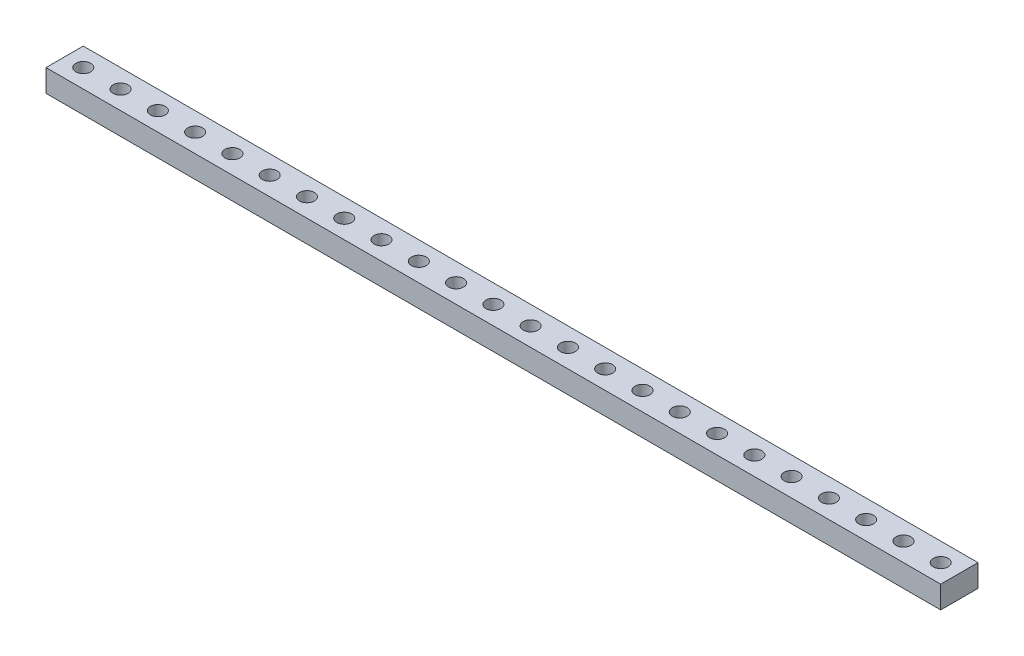
ISO-10303-21;
HEADER;
FILE_DESCRIPTION(('STEP AP214'),'2;1');
FILE_NAME('part.step','',(''),(''),'','','');
FILE_SCHEMA(('AUTOMOTIVE_DESIGN { 1 0 10303 214 1 1 1 1 }'));
ENDSEC;
DATA;
#1=APPLICATION_CONTEXT('core data for automotive mechanical design processes');
#2=APPLICATION_PROTOCOL_DEFINITION('international standard','automotive_design',2000,#1);
#3=PRODUCT_CONTEXT('',#1,'mechanical');
#4=PRODUCT('Part','Part','',(#3));
#5=PRODUCT_RELATED_PRODUCT_CATEGORY('part','',(#4));
#6=PRODUCT_DEFINITION_FORMATION('','',#4);
#7=PRODUCT_DEFINITION_CONTEXT('part definition',#1,'design');
#8=PRODUCT_DEFINITION('design','',#6,#7);
#9=PRODUCT_DEFINITION_SHAPE('','',#8);
#10=(LENGTH_UNIT() NAMED_UNIT(*) SI_UNIT(.MILLI.,.METRE.));
#11=(NAMED_UNIT(*) PLANE_ANGLE_UNIT() SI_UNIT($,.RADIAN.));
#12=(NAMED_UNIT(*) SI_UNIT($,.STERADIAN.) SOLID_ANGLE_UNIT());
#13=UNCERTAINTY_MEASURE_WITH_UNIT(LENGTH_MEASURE(1.E-05),#10,'distance_accuracy_value','');
#14=(GEOMETRIC_REPRESENTATION_CONTEXT(3) GLOBAL_UNCERTAINTY_ASSIGNED_CONTEXT((#13)) GLOBAL_UNIT_ASSIGNED_CONTEXT((#10,
#11,#12)) REPRESENTATION_CONTEXT('',''));
#15=CARTESIAN_POINT('',(0.,0.,0.));
#16=DIRECTION('',(0.,0.,1.));
#17=DIRECTION('',(1.,0.,0.));
#18=AXIS2_PLACEMENT_3D('',#15,#16,#17);
#19=CARTESIAN_POINT('',(0.,6.,0.));
#20=DIRECTION('',(0.,-1.,0.));
#21=DIRECTION('',(0.,0.,-1.));
#22=AXIS2_PLACEMENT_3D('',#19,#20,#21);
#23=PLANE('',#22);
#24=DIRECTION('',(1.,0.,0.));
#25=VECTOR('',#24,1.);
#26=CARTESIAN_POINT('',(0.,6.,0.));
#27=LINE('',#26,#25);
#28=CARTESIAN_POINT('',(-140.,6.,0.));
#29=VERTEX_POINT('',#28);
#30=CARTESIAN_POINT('',(100.,6.,0.));
#31=VERTEX_POINT('',#30);
#32=EDGE_CURVE('E89',#29,#31,#27,.T.);
#33=ORIENTED_EDGE('',*,*,#32,.T.);
#34=DIRECTION('',(0.,0.,1.));
#35=VECTOR('',#34,1.);
#36=CARTESIAN_POINT('',(100.,6.,-10.));
#37=LINE('',#36,#35);
#38=CARTESIAN_POINT('',(100.,6.,-10.));
#39=VERTEX_POINT('',#38);
#40=EDGE_CURVE('E244',#39,#31,#37,.T.);
#41=ORIENTED_EDGE('',*,*,#40,.F.);
#42=DIRECTION('',(-1.,0.,0.));
#43=VECTOR('',#42,1.);
#44=CARTESIAN_POINT('',(-140.,6.,-9.99999999999998));
#45=LINE('',#44,#43);
#46=CARTESIAN_POINT('',(-140.,6.,-9.99999999999998));
#47=VERTEX_POINT('',#46);
#48=EDGE_CURVE('E91',#39,#47,#45,.T.);
#49=ORIENTED_EDGE('',*,*,#48,.T.);
#50=DIRECTION('',(0.,0.,1.));
#51=VECTOR('',#50,1.);
#52=CARTESIAN_POINT('',(-140.,6.,0.));
#53=LINE('',#52,#51);
#54=EDGE_CURVE('E60',#47,#29,#53,.T.);
#55=ORIENTED_EDGE('',*,*,#54,.T.);
#56=EDGE_LOOP('',(#33,#41,#49,#55));
#57=FACE_BOUND('',#56,.T.);
#58=CARTESIAN_POINT('',(-135.,6.,-4.99999999999998));
#59=DIRECTION('',(0.,1.,0.));
#60=DIRECTION('',(0.,0.,1.));
#61=AXIS2_PLACEMENT_3D('',#58,#59,#60);
#62=CIRCLE('',#61,2.);
#63=CARTESIAN_POINT('',(-135.,6.,-2.99999999999999));
#64=VERTEX_POINT('',#63);
#65=EDGE_CURVE('E83',#64,#64,#62,.T.);
#66=ORIENTED_EDGE('',*,*,#65,.F.);
#67=EDGE_LOOP('',(#66));
#68=FACE_BOUND('',#67,.T.);
#69=CARTESIAN_POINT('',(-125.,6.,-4.99999999999998));
#70=DIRECTION('',(0.,1.,0.));
#71=DIRECTION('',(0.,0.,1.));
#72=AXIS2_PLACEMENT_3D('',#69,#70,#71);
#73=CIRCLE('',#72,1.99999999999998);
#74=CARTESIAN_POINT('',(-125.,6.,-3.));
#75=VERTEX_POINT('',#74);
#76=EDGE_CURVE('E100',#75,#75,#73,.T.);
#77=ORIENTED_EDGE('',*,*,#76,.F.);
#78=EDGE_LOOP('',(#77));
#79=FACE_BOUND('',#78,.T.);
#80=CARTESIAN_POINT('',(-115.,6.,-4.99999999999998));
#81=DIRECTION('',(0.,1.,0.));
#82=DIRECTION('',(0.,0.,1.));
#83=AXIS2_PLACEMENT_3D('',#80,#81,#82);
#84=CIRCLE('',#83,2.);
#85=CARTESIAN_POINT('',(-115.,6.,-2.99999999999999));
#86=VERTEX_POINT('',#85);
#87=EDGE_CURVE('E106',#86,#86,#84,.T.);
#88=ORIENTED_EDGE('',*,*,#87,.F.);
#89=EDGE_LOOP('',(#88));
#90=FACE_BOUND('',#89,.T.);
#91=CARTESIAN_POINT('',(-105.,6.,-4.99999999999998));
#92=DIRECTION('',(0.,1.,0.));
#93=DIRECTION('',(0.,0.,1.));
#94=AXIS2_PLACEMENT_3D('',#91,#92,#93);
#95=CIRCLE('',#94,2.);
#96=CARTESIAN_POINT('',(-105.,6.,-2.99999999999999));
#97=VERTEX_POINT('',#96);
#98=EDGE_CURVE('E112',#97,#97,#95,.T.);
#99=ORIENTED_EDGE('',*,*,#98,.F.);
#100=EDGE_LOOP('',(#99));
#101=FACE_BOUND('',#100,.T.);
#102=CARTESIAN_POINT('',(-95.,6.,-4.99999999999998));
#103=DIRECTION('',(0.,1.,0.));
#104=DIRECTION('',(0.,0.,1.));
#105=AXIS2_PLACEMENT_3D('',#102,#103,#104);
#106=CIRCLE('',#105,2.);
#107=CARTESIAN_POINT('',(-95.,6.,-2.99999999999999));
#108=VERTEX_POINT('',#107);
#109=EDGE_CURVE('E118',#108,#108,#106,.T.);
#110=ORIENTED_EDGE('',*,*,#109,.F.);
#111=EDGE_LOOP('',(#110));
#112=FACE_BOUND('',#111,.T.);
#113=CARTESIAN_POINT('',(-85.,6.,-4.99999999999998));
#114=DIRECTION('',(0.,1.,0.));
#115=DIRECTION('',(0.,0.,1.));
#116=AXIS2_PLACEMENT_3D('',#113,#114,#115);
#117=CIRCLE('',#116,2.);
#118=CARTESIAN_POINT('',(-85.,6.,-2.99999999999999));
#119=VERTEX_POINT('',#118);
#120=EDGE_CURVE('E124',#119,#119,#117,.T.);
#121=ORIENTED_EDGE('',*,*,#120,.F.);
#122=EDGE_LOOP('',(#121));
#123=FACE_BOUND('',#122,.T.);
#124=CARTESIAN_POINT('',(-75.,6.,-4.99999999999998));
#125=DIRECTION('',(0.,1.,0.));
#126=DIRECTION('',(0.,0.,1.));
#127=AXIS2_PLACEMENT_3D('',#124,#125,#126);
#128=CIRCLE('',#127,2.);
#129=CARTESIAN_POINT('',(-75.,6.,-2.99999999999999));
#130=VERTEX_POINT('',#129);
#131=EDGE_CURVE('E130',#130,#130,#128,.T.);
#132=ORIENTED_EDGE('',*,*,#131,.F.);
#133=EDGE_LOOP('',(#132));
#134=FACE_BOUND('',#133,.T.);
#135=CARTESIAN_POINT('',(-65.,6.,-4.99999999999998));
#136=DIRECTION('',(0.,1.,0.));
#137=DIRECTION('',(0.,0.,1.));
#138=AXIS2_PLACEMENT_3D('',#135,#136,#137);
#139=CIRCLE('',#138,2.);
#140=CARTESIAN_POINT('',(-65.,6.,-2.99999999999999));
#141=VERTEX_POINT('',#140);
#142=EDGE_CURVE('E136',#141,#141,#139,.T.);
#143=ORIENTED_EDGE('',*,*,#142,.F.);
#144=EDGE_LOOP('',(#143));
#145=FACE_BOUND('',#144,.T.);
#146=CARTESIAN_POINT('',(-55.,6.,-4.99999999999998));
#147=DIRECTION('',(0.,1.,0.));
#148=DIRECTION('',(0.,0.,1.));
#149=AXIS2_PLACEMENT_3D('',#146,#147,#148);
#150=CIRCLE('',#149,2.);
#151=CARTESIAN_POINT('',(-55.,6.,-2.99999999999999));
#152=VERTEX_POINT('',#151);
#153=EDGE_CURVE('E142',#152,#152,#150,.T.);
#154=ORIENTED_EDGE('',*,*,#153,.F.);
#155=EDGE_LOOP('',(#154));
#156=FACE_BOUND('',#155,.T.);
#157=CARTESIAN_POINT('',(-45.,6.,-4.99999999999998));
#158=DIRECTION('',(0.,1.,0.));
#159=DIRECTION('',(0.,0.,1.));
#160=AXIS2_PLACEMENT_3D('',#157,#158,#159);
#161=CIRCLE('',#160,2.);
#162=CARTESIAN_POINT('',(-45.,6.,-2.99999999999999));
#163=VERTEX_POINT('',#162);
#164=EDGE_CURVE('E148',#163,#163,#161,.T.);
#165=ORIENTED_EDGE('',*,*,#164,.F.);
#166=EDGE_LOOP('',(#165));
#167=FACE_BOUND('',#166,.T.);
#168=CARTESIAN_POINT('',(-35.,6.,-4.99999999999998));
#169=DIRECTION('',(0.,1.,0.));
#170=DIRECTION('',(0.,0.,1.));
#171=AXIS2_PLACEMENT_3D('',#168,#169,#170);
#172=CIRCLE('',#171,2.);
#173=CARTESIAN_POINT('',(-35.,6.,-2.99999999999999));
#174=VERTEX_POINT('',#173);
#175=EDGE_CURVE('E154',#174,#174,#172,.T.);
#176=ORIENTED_EDGE('',*,*,#175,.F.);
#177=EDGE_LOOP('',(#176));
#178=FACE_BOUND('',#177,.T.);
#179=CARTESIAN_POINT('',(-25.,6.,-4.99999999999998));
#180=DIRECTION('',(0.,1.,0.));
#181=DIRECTION('',(0.,0.,1.));
#182=AXIS2_PLACEMENT_3D('',#179,#180,#181);
#183=CIRCLE('',#182,2.);
#184=CARTESIAN_POINT('',(-25.,6.,-2.99999999999999));
#185=VERTEX_POINT('',#184);
#186=EDGE_CURVE('E160',#185,#185,#183,.T.);
#187=ORIENTED_EDGE('',*,*,#186,.F.);
#188=EDGE_LOOP('',(#187));
#189=FACE_BOUND('',#188,.T.);
#190=CARTESIAN_POINT('',(-15.,6.,-4.99999999999998));
#191=DIRECTION('',(0.,1.,0.));
#192=DIRECTION('',(0.,0.,1.));
#193=AXIS2_PLACEMENT_3D('',#190,#191,#192);
#194=CIRCLE('',#193,2.);
#195=CARTESIAN_POINT('',(-15.,6.,-2.99999999999999));
#196=VERTEX_POINT('',#195);
#197=EDGE_CURVE('E166',#196,#196,#194,.T.);
#198=ORIENTED_EDGE('',*,*,#197,.F.);
#199=EDGE_LOOP('',(#198));
#200=FACE_BOUND('',#199,.T.);
#201=CARTESIAN_POINT('',(-5.,6.,-4.99999999999998));
#202=DIRECTION('',(0.,1.,0.));
#203=DIRECTION('',(0.,0.,1.));
#204=AXIS2_PLACEMENT_3D('',#201,#202,#203);
#205=CIRCLE('',#204,2.);
#206=CARTESIAN_POINT('',(-5.,6.,-2.99999999999999));
#207=VERTEX_POINT('',#206);
#208=EDGE_CURVE('E172',#207,#207,#205,.T.);
#209=ORIENTED_EDGE('',*,*,#208,.F.);
#210=EDGE_LOOP('',(#209));
#211=FACE_BOUND('',#210,.T.);
#212=CARTESIAN_POINT('',(5.,6.,-4.99999999999998));
#213=DIRECTION('',(0.,1.,0.));
#214=DIRECTION('',(0.,0.,1.));
#215=AXIS2_PLACEMENT_3D('',#212,#213,#214);
#216=CIRCLE('',#215,2.);
#217=CARTESIAN_POINT('',(5.,6.,-2.99999999999999));
#218=VERTEX_POINT('',#217);
#219=EDGE_CURVE('E178',#218,#218,#216,.T.);
#220=ORIENTED_EDGE('',*,*,#219,.F.);
#221=EDGE_LOOP('',(#220));
#222=FACE_BOUND('',#221,.T.);
#223=CARTESIAN_POINT('',(15.,6.,-4.99999999999998));
#224=DIRECTION('',(0.,1.,0.));
#225=DIRECTION('',(0.,0.,1.));
#226=AXIS2_PLACEMENT_3D('',#223,#224,#225);
#227=CIRCLE('',#226,2.);
#228=CARTESIAN_POINT('',(15.,6.,-2.99999999999999));
#229=VERTEX_POINT('',#228);
#230=EDGE_CURVE('E184',#229,#229,#227,.T.);
#231=ORIENTED_EDGE('',*,*,#230,.F.);
#232=EDGE_LOOP('',(#231));
#233=FACE_BOUND('',#232,.T.);
#234=CARTESIAN_POINT('',(25.,6.,-4.99999999999998));
#235=DIRECTION('',(0.,1.,0.));
#236=DIRECTION('',(0.,0.,1.));
#237=AXIS2_PLACEMENT_3D('',#234,#235,#236);
#238=CIRCLE('',#237,2.);
#239=CARTESIAN_POINT('',(25.,6.,-2.99999999999999));
#240=VERTEX_POINT('',#239);
#241=EDGE_CURVE('E190',#240,#240,#238,.T.);
#242=ORIENTED_EDGE('',*,*,#241,.F.);
#243=EDGE_LOOP('',(#242));
#244=FACE_BOUND('',#243,.T.);
#245=CARTESIAN_POINT('',(35.,6.,-4.99999999999998));
#246=DIRECTION('',(0.,1.,0.));
#247=DIRECTION('',(0.,0.,1.));
#248=AXIS2_PLACEMENT_3D('',#245,#246,#247);
#249=CIRCLE('',#248,2.);
#250=CARTESIAN_POINT('',(35.,6.,-2.99999999999999));
#251=VERTEX_POINT('',#250);
#252=EDGE_CURVE('E196',#251,#251,#249,.T.);
#253=ORIENTED_EDGE('',*,*,#252,.F.);
#254=EDGE_LOOP('',(#253));
#255=FACE_BOUND('',#254,.T.);
#256=CARTESIAN_POINT('',(45.,6.,-4.99999999999998));
#257=DIRECTION('',(0.,1.,0.));
#258=DIRECTION('',(0.,0.,1.));
#259=AXIS2_PLACEMENT_3D('',#256,#257,#258);
#260=CIRCLE('',#259,2.);
#261=CARTESIAN_POINT('',(45.,6.,-2.99999999999999));
#262=VERTEX_POINT('',#261);
#263=EDGE_CURVE('E202',#262,#262,#260,.T.);
#264=ORIENTED_EDGE('',*,*,#263,.F.);
#265=EDGE_LOOP('',(#264));
#266=FACE_BOUND('',#265,.T.);
#267=CARTESIAN_POINT('',(55.,6.,-4.99999999999998));
#268=DIRECTION('',(0.,1.,0.));
#269=DIRECTION('',(0.,0.,1.));
#270=AXIS2_PLACEMENT_3D('',#267,#268,#269);
#271=CIRCLE('',#270,2.);
#272=CARTESIAN_POINT('',(55.,6.,-2.99999999999999));
#273=VERTEX_POINT('',#272);
#274=EDGE_CURVE('E208',#273,#273,#271,.T.);
#275=ORIENTED_EDGE('',*,*,#274,.F.);
#276=EDGE_LOOP('',(#275));
#277=FACE_BOUND('',#276,.T.);
#278=CARTESIAN_POINT('',(65.,6.,-4.99999999999998));
#279=DIRECTION('',(0.,1.,0.));
#280=DIRECTION('',(0.,0.,1.));
#281=AXIS2_PLACEMENT_3D('',#278,#279,#280);
#282=CIRCLE('',#281,2.);
#283=CARTESIAN_POINT('',(65.,6.,-2.99999999999999));
#284=VERTEX_POINT('',#283);
#285=EDGE_CURVE('E214',#284,#284,#282,.T.);
#286=ORIENTED_EDGE('',*,*,#285,.F.);
#287=EDGE_LOOP('',(#286));
#288=FACE_BOUND('',#287,.T.);
#289=CARTESIAN_POINT('',(75.,6.,-4.99999999999998));
#290=DIRECTION('',(0.,1.,0.));
#291=DIRECTION('',(0.,0.,1.));
#292=AXIS2_PLACEMENT_3D('',#289,#290,#291);
#293=CIRCLE('',#292,2.);
#294=CARTESIAN_POINT('',(75.,6.,-2.99999999999999));
#295=VERTEX_POINT('',#294);
#296=EDGE_CURVE('E220',#295,#295,#293,.T.);
#297=ORIENTED_EDGE('',*,*,#296,.F.);
#298=EDGE_LOOP('',(#297));
#299=FACE_BOUND('',#298,.T.);
#300=CARTESIAN_POINT('',(85.,6.,-4.99999999999998));
#301=DIRECTION('',(0.,1.,0.));
#302=DIRECTION('',(0.,0.,1.));
#303=AXIS2_PLACEMENT_3D('',#300,#301,#302);
#304=CIRCLE('',#303,2.);
#305=CARTESIAN_POINT('',(85.,6.,-2.99999999999999));
#306=VERTEX_POINT('',#305);
#307=EDGE_CURVE('E226',#306,#306,#304,.T.);
#308=ORIENTED_EDGE('',*,*,#307,.F.);
#309=EDGE_LOOP('',(#308));
#310=FACE_BOUND('',#309,.T.);
#311=CARTESIAN_POINT('',(95.,6.,-4.99999999999998));
#312=DIRECTION('',(0.,1.,0.));
#313=DIRECTION('',(0.,0.,1.));
#314=AXIS2_PLACEMENT_3D('',#311,#312,#313);
#315=CIRCLE('',#314,2.);
#316=CARTESIAN_POINT('',(95.,6.,-2.99999999999999));
#317=VERTEX_POINT('',#316);
#318=EDGE_CURVE('E232',#317,#317,#315,.T.);
#319=ORIENTED_EDGE('',*,*,#318,.F.);
#320=EDGE_LOOP('',(#319));
#321=FACE_BOUND('',#320,.T.);
#322=ADVANCED_FACE('F36',(#57,#68,#79,#90,#101,#112,#123,#134,#145,#156,#167,#178,#189,#200,
#211,#222,#233,#244,#255,#266,#277,#288,#299,#310,#321),#23,.F.);
#323=CARTESIAN_POINT('',(0.,0.,0.));
#324=DIRECTION('',(0.,-1.,0.));
#325=DIRECTION('',(0.,0.,-1.));
#326=AXIS2_PLACEMENT_3D('',#323,#324,#325);
#327=PLANE('',#326);
#328=DIRECTION('',(0.,0.,1.));
#329=VECTOR('',#328,1.);
#330=CARTESIAN_POINT('',(100.,0.,-10.));
#331=LINE('',#330,#329);
#332=CARTESIAN_POINT('',(100.,0.,-9.99999999999998));
#333=VERTEX_POINT('',#332);
#334=CARTESIAN_POINT('',(100.,0.,0.));
#335=VERTEX_POINT('',#334);
#336=EDGE_CURVE('E51',#333,#335,#331,.T.);
#337=ORIENTED_EDGE('',*,*,#336,.T.);
#338=DIRECTION('',(1.,0.,0.));
#339=VECTOR('',#338,1.);
#340=CARTESIAN_POINT('',(0.,0.,0.));
#341=LINE('',#340,#339);
#342=CARTESIAN_POINT('',(-140.,0.,0.));
#343=VERTEX_POINT('',#342);
#344=EDGE_CURVE('E73',#343,#335,#341,.T.);
#345=ORIENTED_EDGE('',*,*,#344,.F.);
#346=DIRECTION('',(0.,0.,1.));
#347=VECTOR('',#346,1.);
#348=CARTESIAN_POINT('',(-140.,0.,0.));
#349=LINE('',#348,#347);
#350=CARTESIAN_POINT('',(-140.,0.,-9.99999999999998));
#351=VERTEX_POINT('',#350);
#352=EDGE_CURVE('E78',#351,#343,#349,.T.);
#353=ORIENTED_EDGE('',*,*,#352,.F.);
#354=DIRECTION('',(-1.,0.,0.));
#355=VECTOR('',#354,1.);
#356=CARTESIAN_POINT('',(-140.,0.,-9.99999999999998));
#357=LINE('',#356,#355);
#358=EDGE_CURVE('E82',#333,#351,#357,.T.);
#359=ORIENTED_EDGE('',*,*,#358,.F.);
#360=EDGE_LOOP('',(#337,#345,#353,#359));
#361=FACE_BOUND('',#360,.T.);
#362=CARTESIAN_POINT('',(85.,0.,-4.99999999999998));
#363=DIRECTION('',(0.,1.,0.));
#364=DIRECTION('',(0.,0.,1.));
#365=AXIS2_PLACEMENT_3D('',#362,#363,#364);
#366=CIRCLE('',#365,2.);
#367=CARTESIAN_POINT('',(85.,0.,-2.99999999999999));
#368=VERTEX_POINT('',#367);
#369=EDGE_CURVE('E229',#368,#368,#366,.T.);
#370=ORIENTED_EDGE('',*,*,#369,.T.);
#371=EDGE_LOOP('',(#370));
#372=FACE_BOUND('',#371,.T.);
#373=CARTESIAN_POINT('',(65.,0.,-4.99999999999998));
#374=DIRECTION('',(0.,1.,0.));
#375=DIRECTION('',(0.,0.,1.));
#376=AXIS2_PLACEMENT_3D('',#373,#374,#375);
#377=CIRCLE('',#376,2.);
#378=CARTESIAN_POINT('',(65.,0.,-2.99999999999999));
#379=VERTEX_POINT('',#378);
#380=EDGE_CURVE('E217',#379,#379,#377,.T.);
#381=ORIENTED_EDGE('',*,*,#380,.T.);
#382=EDGE_LOOP('',(#381));
#383=FACE_BOUND('',#382,.T.);
#384=CARTESIAN_POINT('',(45.,0.,-4.99999999999998));
#385=DIRECTION('',(0.,1.,0.));
#386=DIRECTION('',(0.,0.,1.));
#387=AXIS2_PLACEMENT_3D('',#384,#385,#386);
#388=CIRCLE('',#387,2.);
#389=CARTESIAN_POINT('',(45.,0.,-2.99999999999999));
#390=VERTEX_POINT('',#389);
#391=EDGE_CURVE('E205',#390,#390,#388,.T.);
#392=ORIENTED_EDGE('',*,*,#391,.T.);
#393=EDGE_LOOP('',(#392));
#394=FACE_BOUND('',#393,.T.);
#395=CARTESIAN_POINT('',(25.,0.,-4.99999999999998));
#396=DIRECTION('',(0.,1.,0.));
#397=DIRECTION('',(0.,0.,1.));
#398=AXIS2_PLACEMENT_3D('',#395,#396,#397);
#399=CIRCLE('',#398,2.);
#400=CARTESIAN_POINT('',(25.,0.,-2.99999999999999));
#401=VERTEX_POINT('',#400);
#402=EDGE_CURVE('E193',#401,#401,#399,.T.);
#403=ORIENTED_EDGE('',*,*,#402,.T.);
#404=EDGE_LOOP('',(#403));
#405=FACE_BOUND('',#404,.T.);
#406=CARTESIAN_POINT('',(5.,0.,-4.99999999999998));
#407=DIRECTION('',(0.,1.,0.));
#408=DIRECTION('',(0.,0.,1.));
#409=AXIS2_PLACEMENT_3D('',#406,#407,#408);
#410=CIRCLE('',#409,2.);
#411=CARTESIAN_POINT('',(5.,0.,-2.99999999999999));
#412=VERTEX_POINT('',#411);
#413=EDGE_CURVE('E181',#412,#412,#410,.T.);
#414=ORIENTED_EDGE('',*,*,#413,.T.);
#415=EDGE_LOOP('',(#414));
#416=FACE_BOUND('',#415,.T.);
#417=CARTESIAN_POINT('',(-15.,0.,-4.99999999999998));
#418=DIRECTION('',(0.,1.,0.));
#419=DIRECTION('',(0.,0.,1.));
#420=AXIS2_PLACEMENT_3D('',#417,#418,#419);
#421=CIRCLE('',#420,2.);
#422=CARTESIAN_POINT('',(-15.,0.,-2.99999999999999));
#423=VERTEX_POINT('',#422);
#424=EDGE_CURVE('E169',#423,#423,#421,.T.);
#425=ORIENTED_EDGE('',*,*,#424,.T.);
#426=EDGE_LOOP('',(#425));
#427=FACE_BOUND('',#426,.T.);
#428=CARTESIAN_POINT('',(-35.,0.,-4.99999999999998));
#429=DIRECTION('',(0.,1.,0.));
#430=DIRECTION('',(0.,0.,1.));
#431=AXIS2_PLACEMENT_3D('',#428,#429,#430);
#432=CIRCLE('',#431,2.);
#433=CARTESIAN_POINT('',(-35.,0.,-2.99999999999999));
#434=VERTEX_POINT('',#433);
#435=EDGE_CURVE('E157',#434,#434,#432,.T.);
#436=ORIENTED_EDGE('',*,*,#435,.T.);
#437=EDGE_LOOP('',(#436));
#438=FACE_BOUND('',#437,.T.);
#439=CARTESIAN_POINT('',(-55.,0.,-4.99999999999998));
#440=DIRECTION('',(0.,1.,0.));
#441=DIRECTION('',(0.,0.,1.));
#442=AXIS2_PLACEMENT_3D('',#439,#440,#441);
#443=CIRCLE('',#442,2.);
#444=CARTESIAN_POINT('',(-55.,0.,-2.99999999999999));
#445=VERTEX_POINT('',#444);
#446=EDGE_CURVE('E145',#445,#445,#443,.T.);
#447=ORIENTED_EDGE('',*,*,#446,.T.);
#448=EDGE_LOOP('',(#447));
#449=FACE_BOUND('',#448,.T.);
#450=CARTESIAN_POINT('',(-75.,0.,-4.99999999999998));
#451=DIRECTION('',(0.,1.,0.));
#452=DIRECTION('',(0.,0.,1.));
#453=AXIS2_PLACEMENT_3D('',#450,#451,#452);
#454=CIRCLE('',#453,2.);
#455=CARTESIAN_POINT('',(-75.,0.,-2.99999999999999));
#456=VERTEX_POINT('',#455);
#457=EDGE_CURVE('E133',#456,#456,#454,.T.);
#458=ORIENTED_EDGE('',*,*,#457,.T.);
#459=EDGE_LOOP('',(#458));
#460=FACE_BOUND('',#459,.T.);
#461=CARTESIAN_POINT('',(-95.,0.,-4.99999999999998));
#462=DIRECTION('',(0.,1.,0.));
#463=DIRECTION('',(0.,0.,1.));
#464=AXIS2_PLACEMENT_3D('',#461,#462,#463);
#465=CIRCLE('',#464,2.);
#466=CARTESIAN_POINT('',(-95.,0.,-2.99999999999999));
#467=VERTEX_POINT('',#466);
#468=EDGE_CURVE('E121',#467,#467,#465,.T.);
#469=ORIENTED_EDGE('',*,*,#468,.T.);
#470=EDGE_LOOP('',(#469));
#471=FACE_BOUND('',#470,.T.);
#472=CARTESIAN_POINT('',(-115.,0.,-4.99999999999998));
#473=DIRECTION('',(0.,1.,0.));
#474=DIRECTION('',(0.,0.,1.));
#475=AXIS2_PLACEMENT_3D('',#472,#473,#474);
#476=CIRCLE('',#475,2.);
#477=CARTESIAN_POINT('',(-115.,0.,-2.99999999999999));
#478=VERTEX_POINT('',#477);
#479=EDGE_CURVE('E109',#478,#478,#476,.T.);
#480=ORIENTED_EDGE('',*,*,#479,.T.);
#481=EDGE_LOOP('',(#480));
#482=FACE_BOUND('',#481,.T.);
#483=CARTESIAN_POINT('',(-135.,0.,-4.99999999999998));
#484=DIRECTION('',(0.,1.,0.));
#485=DIRECTION('',(0.,0.,1.));
#486=AXIS2_PLACEMENT_3D('',#483,#484,#485);
#487=CIRCLE('',#486,2.);
#488=CARTESIAN_POINT('',(-135.,0.,-2.99999999999999));
#489=VERTEX_POINT('',#488);
#490=EDGE_CURVE('E97',#489,#489,#487,.T.);
#491=ORIENTED_EDGE('',*,*,#490,.T.);
#492=EDGE_LOOP('',(#491));
#493=FACE_BOUND('',#492,.T.);
#494=CARTESIAN_POINT('',(-125.,0.,-4.99999999999998));
#495=DIRECTION('',(0.,1.,0.));
#496=DIRECTION('',(0.,0.,1.));
#497=AXIS2_PLACEMENT_3D('',#494,#495,#496);
#498=CIRCLE('',#497,1.99999999999998);
#499=CARTESIAN_POINT('',(-125.,0.,-3.));
#500=VERTEX_POINT('',#499);
#501=EDGE_CURVE('E103',#500,#500,#498,.T.);
#502=ORIENTED_EDGE('',*,*,#501,.T.);
#503=EDGE_LOOP('',(#502));
#504=FACE_BOUND('',#503,.T.);
#505=CARTESIAN_POINT('',(-105.,0.,-4.99999999999998));
#506=DIRECTION('',(0.,1.,0.));
#507=DIRECTION('',(0.,0.,1.));
#508=AXIS2_PLACEMENT_3D('',#505,#506,#507);
#509=CIRCLE('',#508,2.);
#510=CARTESIAN_POINT('',(-105.,0.,-2.99999999999999));
#511=VERTEX_POINT('',#510);
#512=EDGE_CURVE('E115',#511,#511,#509,.T.);
#513=ORIENTED_EDGE('',*,*,#512,.T.);
#514=EDGE_LOOP('',(#513));
#515=FACE_BOUND('',#514,.T.);
#516=CARTESIAN_POINT('',(-85.,0.,-4.99999999999998));
#517=DIRECTION('',(0.,1.,0.));
#518=DIRECTION('',(0.,0.,1.));
#519=AXIS2_PLACEMENT_3D('',#516,#517,#518);
#520=CIRCLE('',#519,2.);
#521=CARTESIAN_POINT('',(-85.,0.,-2.99999999999999));
#522=VERTEX_POINT('',#521);
#523=EDGE_CURVE('E127',#522,#522,#520,.T.);
#524=ORIENTED_EDGE('',*,*,#523,.T.);
#525=EDGE_LOOP('',(#524));
#526=FACE_BOUND('',#525,.T.);
#527=CARTESIAN_POINT('',(-65.,0.,-4.99999999999998));
#528=DIRECTION('',(0.,1.,0.));
#529=DIRECTION('',(0.,0.,1.));
#530=AXIS2_PLACEMENT_3D('',#527,#528,#529);
#531=CIRCLE('',#530,2.);
#532=CARTESIAN_POINT('',(-65.,0.,-2.99999999999999));
#533=VERTEX_POINT('',#532);
#534=EDGE_CURVE('E139',#533,#533,#531,.T.);
#535=ORIENTED_EDGE('',*,*,#534,.T.);
#536=EDGE_LOOP('',(#535));
#537=FACE_BOUND('',#536,.T.);
#538=CARTESIAN_POINT('',(-45.,0.,-4.99999999999998));
#539=DIRECTION('',(0.,1.,0.));
#540=DIRECTION('',(0.,0.,1.));
#541=AXIS2_PLACEMENT_3D('',#538,#539,#540);
#542=CIRCLE('',#541,2.);
#543=CARTESIAN_POINT('',(-45.,0.,-2.99999999999999));
#544=VERTEX_POINT('',#543);
#545=EDGE_CURVE('E151',#544,#544,#542,.T.);
#546=ORIENTED_EDGE('',*,*,#545,.T.);
#547=EDGE_LOOP('',(#546));
#548=FACE_BOUND('',#547,.T.);
#549=CARTESIAN_POINT('',(-25.,0.,-4.99999999999998));
#550=DIRECTION('',(0.,1.,0.));
#551=DIRECTION('',(0.,0.,1.));
#552=AXIS2_PLACEMENT_3D('',#549,#550,#551);
#553=CIRCLE('',#552,2.);
#554=CARTESIAN_POINT('',(-25.,0.,-2.99999999999999));
#555=VERTEX_POINT('',#554);
#556=EDGE_CURVE('E163',#555,#555,#553,.T.);
#557=ORIENTED_EDGE('',*,*,#556,.T.);
#558=EDGE_LOOP('',(#557));
#559=FACE_BOUND('',#558,.T.);
#560=CARTESIAN_POINT('',(-5.,0.,-4.99999999999998));
#561=DIRECTION('',(0.,1.,0.));
#562=DIRECTION('',(0.,0.,1.));
#563=AXIS2_PLACEMENT_3D('',#560,#561,#562);
#564=CIRCLE('',#563,2.);
#565=CARTESIAN_POINT('',(-5.,0.,-2.99999999999999));
#566=VERTEX_POINT('',#565);
#567=EDGE_CURVE('E175',#566,#566,#564,.T.);
#568=ORIENTED_EDGE('',*,*,#567,.T.);
#569=EDGE_LOOP('',(#568));
#570=FACE_BOUND('',#569,.T.);
#571=CARTESIAN_POINT('',(15.,0.,-4.99999999999998));
#572=DIRECTION('',(0.,1.,0.));
#573=DIRECTION('',(0.,0.,1.));
#574=AXIS2_PLACEMENT_3D('',#571,#572,#573);
#575=CIRCLE('',#574,2.);
#576=CARTESIAN_POINT('',(15.,0.,-2.99999999999999));
#577=VERTEX_POINT('',#576);
#578=EDGE_CURVE('E187',#577,#577,#575,.T.);
#579=ORIENTED_EDGE('',*,*,#578,.T.);
#580=EDGE_LOOP('',(#579));
#581=FACE_BOUND('',#580,.T.);
#582=CARTESIAN_POINT('',(35.,0.,-4.99999999999998));
#583=DIRECTION('',(0.,1.,0.));
#584=DIRECTION('',(0.,0.,1.));
#585=AXIS2_PLACEMENT_3D('',#582,#583,#584);
#586=CIRCLE('',#585,2.);
#587=CARTESIAN_POINT('',(35.,0.,-2.99999999999999));
#588=VERTEX_POINT('',#587);
#589=EDGE_CURVE('E199',#588,#588,#586,.T.);
#590=ORIENTED_EDGE('',*,*,#589,.T.);
#591=EDGE_LOOP('',(#590));
#592=FACE_BOUND('',#591,.T.);
#593=CARTESIAN_POINT('',(55.,0.,-4.99999999999998));
#594=DIRECTION('',(0.,1.,0.));
#595=DIRECTION('',(0.,0.,1.));
#596=AXIS2_PLACEMENT_3D('',#593,#594,#595);
#597=CIRCLE('',#596,2.);
#598=CARTESIAN_POINT('',(55.,0.,-2.99999999999999));
#599=VERTEX_POINT('',#598);
#600=EDGE_CURVE('E211',#599,#599,#597,.T.);
#601=ORIENTED_EDGE('',*,*,#600,.T.);
#602=EDGE_LOOP('',(#601));
#603=FACE_BOUND('',#602,.T.);
#604=CARTESIAN_POINT('',(75.,0.,-4.99999999999998));
#605=DIRECTION('',(0.,1.,0.));
#606=DIRECTION('',(0.,0.,1.));
#607=AXIS2_PLACEMENT_3D('',#604,#605,#606);
#608=CIRCLE('',#607,2.);
#609=CARTESIAN_POINT('',(75.,0.,-2.99999999999999));
#610=VERTEX_POINT('',#609);
#611=EDGE_CURVE('E223',#610,#610,#608,.T.);
#612=ORIENTED_EDGE('',*,*,#611,.T.);
#613=EDGE_LOOP('',(#612));
#614=FACE_BOUND('',#613,.T.);
#615=CARTESIAN_POINT('',(95.,0.,-4.99999999999998));
#616=DIRECTION('',(0.,1.,0.));
#617=DIRECTION('',(0.,0.,1.));
#618=AXIS2_PLACEMENT_3D('',#615,#616,#617);
#619=CIRCLE('',#618,2.);
#620=CARTESIAN_POINT('',(95.,0.,-2.99999999999999));
#621=VERTEX_POINT('',#620);
#622=EDGE_CURVE('E235',#621,#621,#619,.T.);
#623=ORIENTED_EDGE('',*,*,#622,.T.);
#624=EDGE_LOOP('',(#623));
#625=FACE_BOUND('',#624,.T.);
#626=ADVANCED_FACE('F75',(#361,#372,#383,#394,#405,#416,#427,#438,#449,#460,#471,#482,#493,#504,
#515,#526,#537,#548,#559,#570,#581,#592,#603,#614,#625),#327,.T.);
#627=CARTESIAN_POINT('',(0.,6.,0.));
#628=DIRECTION('',(0.,0.,-1.));
#629=DIRECTION('',(-1.,0.,0.));
#630=AXIS2_PLACEMENT_3D('',#627,#628,#629);
#631=PLANE('',#630);
#632=ORIENTED_EDGE('',*,*,#344,.T.);
#633=DIRECTION('',(0.,1.,0.));
#634=VECTOR('',#633,1.);
#635=CARTESIAN_POINT('',(100.,-0.00100000000000013,0.));
#636=LINE('',#635,#634);
#637=EDGE_CURVE('E241',#335,#31,#636,.T.);
#638=ORIENTED_EDGE('',*,*,#637,.T.);
#639=ORIENTED_EDGE('',*,*,#32,.F.);
#640=DIRECTION('',(0.,-1.,0.));
#641=VECTOR('',#640,1.);
#642=CARTESIAN_POINT('',(-140.,6.,0.));
#643=LINE('',#642,#641);
#644=EDGE_CURVE('E44',#29,#343,#643,.T.);
#645=ORIENTED_EDGE('',*,*,#644,.T.);
#646=EDGE_LOOP('',(#632,#638,#639,#645));
#647=FACE_BOUND('',#646,.T.);
#648=ADVANCED_FACE('F38',(#647),#631,.F.);
#649=CARTESIAN_POINT('',(-140.,6.,-9.99999999999998));
#650=DIRECTION('',(0.,0.,1.));
#651=DIRECTION('',(1.,0.,0.));
#652=AXIS2_PLACEMENT_3D('',#649,#650,#651);
#653=PLANE('',#652);
#654=ORIENTED_EDGE('',*,*,#48,.F.);
#655=DIRECTION('',(0.,1.,0.));
#656=VECTOR('',#655,1.);
#657=CARTESIAN_POINT('',(100.,-0.00100000000000013,-10.));
#658=LINE('',#657,#656);
#659=EDGE_CURVE('E242',#333,#39,#658,.T.);
#660=ORIENTED_EDGE('',*,*,#659,.F.);
#661=ORIENTED_EDGE('',*,*,#358,.T.);
#662=DIRECTION('',(0.,-1.,0.));
#663=VECTOR('',#662,1.);
#664=CARTESIAN_POINT('',(-140.,6.,-9.99999999999998));
#665=LINE('',#664,#663);
#666=EDGE_CURVE('E11',#47,#351,#665,.T.);
#667=ORIENTED_EDGE('',*,*,#666,.F.);
#668=EDGE_LOOP('',(#654,#660,#661,#667));
#669=FACE_BOUND('',#668,.T.);
#670=ADVANCED_FACE('F316',(#669),#653,.F.);
#671=CARTESIAN_POINT('',(-140.,6.,0.));
#672=DIRECTION('',(1.,0.,0.));
#673=DIRECTION('',(0.,0.,-1.));
#674=AXIS2_PLACEMENT_3D('',#671,#672,#673);
#675=PLANE('',#674);
#676=ORIENTED_EDGE('',*,*,#352,.T.);
#677=ORIENTED_EDGE('',*,*,#644,.F.);
#678=ORIENTED_EDGE('',*,*,#54,.F.);
#679=ORIENTED_EDGE('',*,*,#666,.T.);
#680=EDGE_LOOP('',(#676,#677,#678,#679));
#681=FACE_BOUND('',#680,.T.);
#682=ADVANCED_FACE('F86',(#681),#675,.F.);
#683=CARTESIAN_POINT('',(-135.,6.,-4.99999999999998));
#684=DIRECTION('',(0.,-1.,0.));
#685=DIRECTION('',(0.,0.,-1.));
#686=AXIS2_PLACEMENT_3D('',#683,#684,#685);
#687=CYLINDRICAL_SURFACE('',#686,2.);
#688=ORIENTED_EDGE('',*,*,#65,.T.);
#689=EDGE_LOOP('',(#688));
#690=FACE_BOUND('',#689,.T.);
#691=ORIENTED_EDGE('',*,*,#490,.F.);
#692=EDGE_LOOP('',(#691));
#693=FACE_BOUND('',#692,.T.);
#694=ADVANCED_FACE('F320',(#690,#693),#687,.F.);
#695=CARTESIAN_POINT('',(-125.,6.,-4.99999999999998));
#696=DIRECTION('',(0.,-1.,0.));
#697=DIRECTION('',(0.,0.,-1.));
#698=AXIS2_PLACEMENT_3D('',#695,#696,#697);
#699=CYLINDRICAL_SURFACE('',#698,1.99999999999998);
#700=ORIENTED_EDGE('',*,*,#76,.T.);
#701=EDGE_LOOP('',(#700));
#702=FACE_BOUND('',#701,.T.);
#703=ORIENTED_EDGE('',*,*,#501,.F.);
#704=EDGE_LOOP('',(#703));
#705=FACE_BOUND('',#704,.T.);
#706=ADVANCED_FACE('F506',(#702,#705),#699,.F.);
#707=CARTESIAN_POINT('',(-115.,6.,-4.99999999999998));
#708=DIRECTION('',(0.,-1.,0.));
#709=DIRECTION('',(0.,0.,-1.));
#710=AXIS2_PLACEMENT_3D('',#707,#708,#709);
#711=CYLINDRICAL_SURFACE('',#710,2.);
#712=ORIENTED_EDGE('',*,*,#87,.T.);
#713=EDGE_LOOP('',(#712));
#714=FACE_BOUND('',#713,.T.);
#715=ORIENTED_EDGE('',*,*,#479,.F.);
#716=EDGE_LOOP('',(#715));
#717=FACE_BOUND('',#716,.T.);
#718=ADVANCED_FACE('F498',(#714,#717),#711,.F.);
#719=CARTESIAN_POINT('',(-105.,6.,-4.99999999999998));
#720=DIRECTION('',(0.,-1.,0.));
#721=DIRECTION('',(0.,0.,-1.));
#722=AXIS2_PLACEMENT_3D('',#719,#720,#721);
#723=CYLINDRICAL_SURFACE('',#722,2.);
#724=ORIENTED_EDGE('',*,*,#98,.T.);
#725=EDGE_LOOP('',(#724));
#726=FACE_BOUND('',#725,.T.);
#727=ORIENTED_EDGE('',*,*,#512,.F.);
#728=EDGE_LOOP('',(#727));
#729=FACE_BOUND('',#728,.T.);
#730=ADVANCED_FACE('F490',(#726,#729),#723,.F.);
#731=CARTESIAN_POINT('',(-95.,6.,-4.99999999999998));
#732=DIRECTION('',(0.,-1.,0.));
#733=DIRECTION('',(0.,0.,-1.));
#734=AXIS2_PLACEMENT_3D('',#731,#732,#733);
#735=CYLINDRICAL_SURFACE('',#734,2.);
#736=ORIENTED_EDGE('',*,*,#109,.T.);
#737=EDGE_LOOP('',(#736));
#738=FACE_BOUND('',#737,.T.);
#739=ORIENTED_EDGE('',*,*,#468,.F.);
#740=EDGE_LOOP('',(#739));
#741=FACE_BOUND('',#740,.T.);
#742=ADVANCED_FACE('F482',(#738,#741),#735,.F.);
#743=CARTESIAN_POINT('',(-85.,6.,-4.99999999999998));
#744=DIRECTION('',(0.,-1.,0.));
#745=DIRECTION('',(0.,0.,-1.));
#746=AXIS2_PLACEMENT_3D('',#743,#744,#745);
#747=CYLINDRICAL_SURFACE('',#746,2.);
#748=ORIENTED_EDGE('',*,*,#120,.T.);
#749=EDGE_LOOP('',(#748));
#750=FACE_BOUND('',#749,.T.);
#751=ORIENTED_EDGE('',*,*,#523,.F.);
#752=EDGE_LOOP('',(#751));
#753=FACE_BOUND('',#752,.T.);
#754=ADVANCED_FACE('F474',(#750,#753),#747,.F.);
#755=CARTESIAN_POINT('',(-75.,6.,-4.99999999999998));
#756=DIRECTION('',(0.,-1.,0.));
#757=DIRECTION('',(0.,0.,-1.));
#758=AXIS2_PLACEMENT_3D('',#755,#756,#757);
#759=CYLINDRICAL_SURFACE('',#758,2.);
#760=ORIENTED_EDGE('',*,*,#131,.T.);
#761=EDGE_LOOP('',(#760));
#762=FACE_BOUND('',#761,.T.);
#763=ORIENTED_EDGE('',*,*,#457,.F.);
#764=EDGE_LOOP('',(#763));
#765=FACE_BOUND('',#764,.T.);
#766=ADVANCED_FACE('F466',(#762,#765),#759,.F.);
#767=CARTESIAN_POINT('',(-65.,6.,-4.99999999999998));
#768=DIRECTION('',(0.,-1.,0.));
#769=DIRECTION('',(0.,0.,-1.));
#770=AXIS2_PLACEMENT_3D('',#767,#768,#769);
#771=CYLINDRICAL_SURFACE('',#770,2.);
#772=ORIENTED_EDGE('',*,*,#142,.T.);
#773=EDGE_LOOP('',(#772));
#774=FACE_BOUND('',#773,.T.);
#775=ORIENTED_EDGE('',*,*,#534,.F.);
#776=EDGE_LOOP('',(#775));
#777=FACE_BOUND('',#776,.T.);
#778=ADVANCED_FACE('F458',(#774,#777),#771,.F.);
#779=CARTESIAN_POINT('',(-55.,6.,-4.99999999999998));
#780=DIRECTION('',(0.,-1.,0.));
#781=DIRECTION('',(0.,0.,-1.));
#782=AXIS2_PLACEMENT_3D('',#779,#780,#781);
#783=CYLINDRICAL_SURFACE('',#782,2.);
#784=ORIENTED_EDGE('',*,*,#153,.T.);
#785=EDGE_LOOP('',(#784));
#786=FACE_BOUND('',#785,.T.);
#787=ORIENTED_EDGE('',*,*,#446,.F.);
#788=EDGE_LOOP('',(#787));
#789=FACE_BOUND('',#788,.T.);
#790=ADVANCED_FACE('F450',(#786,#789),#783,.F.);
#791=CARTESIAN_POINT('',(-45.,6.,-4.99999999999998));
#792=DIRECTION('',(0.,-1.,0.));
#793=DIRECTION('',(0.,0.,-1.));
#794=AXIS2_PLACEMENT_3D('',#791,#792,#793);
#795=CYLINDRICAL_SURFACE('',#794,2.);
#796=ORIENTED_EDGE('',*,*,#164,.T.);
#797=EDGE_LOOP('',(#796));
#798=FACE_BOUND('',#797,.T.);
#799=ORIENTED_EDGE('',*,*,#545,.F.);
#800=EDGE_LOOP('',(#799));
#801=FACE_BOUND('',#800,.T.);
#802=ADVANCED_FACE('F442',(#798,#801),#795,.F.);
#803=CARTESIAN_POINT('',(-35.,6.,-4.99999999999998));
#804=DIRECTION('',(0.,-1.,0.));
#805=DIRECTION('',(0.,0.,-1.));
#806=AXIS2_PLACEMENT_3D('',#803,#804,#805);
#807=CYLINDRICAL_SURFACE('',#806,2.);
#808=ORIENTED_EDGE('',*,*,#175,.T.);
#809=EDGE_LOOP('',(#808));
#810=FACE_BOUND('',#809,.T.);
#811=ORIENTED_EDGE('',*,*,#435,.F.);
#812=EDGE_LOOP('',(#811));
#813=FACE_BOUND('',#812,.T.);
#814=ADVANCED_FACE('F434',(#810,#813),#807,.F.);
#815=CARTESIAN_POINT('',(-25.,6.,-4.99999999999998));
#816=DIRECTION('',(0.,-1.,0.));
#817=DIRECTION('',(0.,0.,-1.));
#818=AXIS2_PLACEMENT_3D('',#815,#816,#817);
#819=CYLINDRICAL_SURFACE('',#818,2.);
#820=ORIENTED_EDGE('',*,*,#186,.T.);
#821=EDGE_LOOP('',(#820));
#822=FACE_BOUND('',#821,.T.);
#823=ORIENTED_EDGE('',*,*,#556,.F.);
#824=EDGE_LOOP('',(#823));
#825=FACE_BOUND('',#824,.T.);
#826=ADVANCED_FACE('F426',(#822,#825),#819,.F.);
#827=CARTESIAN_POINT('',(-15.,6.,-4.99999999999998));
#828=DIRECTION('',(0.,-1.,0.));
#829=DIRECTION('',(0.,0.,-1.));
#830=AXIS2_PLACEMENT_3D('',#827,#828,#829);
#831=CYLINDRICAL_SURFACE('',#830,2.);
#832=ORIENTED_EDGE('',*,*,#197,.T.);
#833=EDGE_LOOP('',(#832));
#834=FACE_BOUND('',#833,.T.);
#835=ORIENTED_EDGE('',*,*,#424,.F.);
#836=EDGE_LOOP('',(#835));
#837=FACE_BOUND('',#836,.T.);
#838=ADVANCED_FACE('F418',(#834,#837),#831,.F.);
#839=CARTESIAN_POINT('',(-5.,6.,-4.99999999999998));
#840=DIRECTION('',(0.,-1.,0.));
#841=DIRECTION('',(0.,0.,-1.));
#842=AXIS2_PLACEMENT_3D('',#839,#840,#841);
#843=CYLINDRICAL_SURFACE('',#842,2.);
#844=ORIENTED_EDGE('',*,*,#208,.T.);
#845=EDGE_LOOP('',(#844));
#846=FACE_BOUND('',#845,.T.);
#847=ORIENTED_EDGE('',*,*,#567,.F.);
#848=EDGE_LOOP('',(#847));
#849=FACE_BOUND('',#848,.T.);
#850=ADVANCED_FACE('F410',(#846,#849),#843,.F.);
#851=CARTESIAN_POINT('',(5.,6.,-4.99999999999998));
#852=DIRECTION('',(0.,-1.,0.));
#853=DIRECTION('',(0.,0.,-1.));
#854=AXIS2_PLACEMENT_3D('',#851,#852,#853);
#855=CYLINDRICAL_SURFACE('',#854,2.);
#856=ORIENTED_EDGE('',*,*,#219,.T.);
#857=EDGE_LOOP('',(#856));
#858=FACE_BOUND('',#857,.T.);
#859=ORIENTED_EDGE('',*,*,#413,.F.);
#860=EDGE_LOOP('',(#859));
#861=FACE_BOUND('',#860,.T.);
#862=ADVANCED_FACE('F402',(#858,#861),#855,.F.);
#863=CARTESIAN_POINT('',(15.,6.,-4.99999999999998));
#864=DIRECTION('',(0.,-1.,0.));
#865=DIRECTION('',(0.,0.,-1.));
#866=AXIS2_PLACEMENT_3D('',#863,#864,#865);
#867=CYLINDRICAL_SURFACE('',#866,2.);
#868=ORIENTED_EDGE('',*,*,#230,.T.);
#869=EDGE_LOOP('',(#868));
#870=FACE_BOUND('',#869,.T.);
#871=ORIENTED_EDGE('',*,*,#578,.F.);
#872=EDGE_LOOP('',(#871));
#873=FACE_BOUND('',#872,.T.);
#874=ADVANCED_FACE('F394',(#870,#873),#867,.F.);
#875=CARTESIAN_POINT('',(25.,6.,-4.99999999999998));
#876=DIRECTION('',(0.,-1.,0.));
#877=DIRECTION('',(0.,0.,-1.));
#878=AXIS2_PLACEMENT_3D('',#875,#876,#877);
#879=CYLINDRICAL_SURFACE('',#878,2.);
#880=ORIENTED_EDGE('',*,*,#241,.T.);
#881=EDGE_LOOP('',(#880));
#882=FACE_BOUND('',#881,.T.);
#883=ORIENTED_EDGE('',*,*,#402,.F.);
#884=EDGE_LOOP('',(#883));
#885=FACE_BOUND('',#884,.T.);
#886=ADVANCED_FACE('F386',(#882,#885),#879,.F.);
#887=CARTESIAN_POINT('',(35.,6.,-4.99999999999998));
#888=DIRECTION('',(0.,-1.,0.));
#889=DIRECTION('',(0.,0.,-1.));
#890=AXIS2_PLACEMENT_3D('',#887,#888,#889);
#891=CYLINDRICAL_SURFACE('',#890,2.);
#892=ORIENTED_EDGE('',*,*,#252,.T.);
#893=EDGE_LOOP('',(#892));
#894=FACE_BOUND('',#893,.T.);
#895=ORIENTED_EDGE('',*,*,#589,.F.);
#896=EDGE_LOOP('',(#895));
#897=FACE_BOUND('',#896,.T.);
#898=ADVANCED_FACE('F378',(#894,#897),#891,.F.);
#899=CARTESIAN_POINT('',(45.,6.,-4.99999999999998));
#900=DIRECTION('',(0.,-1.,0.));
#901=DIRECTION('',(0.,0.,-1.));
#902=AXIS2_PLACEMENT_3D('',#899,#900,#901);
#903=CYLINDRICAL_SURFACE('',#902,2.);
#904=ORIENTED_EDGE('',*,*,#263,.T.);
#905=EDGE_LOOP('',(#904));
#906=FACE_BOUND('',#905,.T.);
#907=ORIENTED_EDGE('',*,*,#391,.F.);
#908=EDGE_LOOP('',(#907));
#909=FACE_BOUND('',#908,.T.);
#910=ADVANCED_FACE('F370',(#906,#909),#903,.F.);
#911=CARTESIAN_POINT('',(55.,6.,-4.99999999999998));
#912=DIRECTION('',(0.,-1.,0.));
#913=DIRECTION('',(0.,0.,-1.));
#914=AXIS2_PLACEMENT_3D('',#911,#912,#913);
#915=CYLINDRICAL_SURFACE('',#914,2.);
#916=ORIENTED_EDGE('',*,*,#274,.T.);
#917=EDGE_LOOP('',(#916));
#918=FACE_BOUND('',#917,.T.);
#919=ORIENTED_EDGE('',*,*,#600,.F.);
#920=EDGE_LOOP('',(#919));
#921=FACE_BOUND('',#920,.T.);
#922=ADVANCED_FACE('F362',(#918,#921),#915,.F.);
#923=CARTESIAN_POINT('',(65.,6.,-4.99999999999998));
#924=DIRECTION('',(0.,-1.,0.));
#925=DIRECTION('',(0.,0.,-1.));
#926=AXIS2_PLACEMENT_3D('',#923,#924,#925);
#927=CYLINDRICAL_SURFACE('',#926,2.);
#928=ORIENTED_EDGE('',*,*,#285,.T.);
#929=EDGE_LOOP('',(#928));
#930=FACE_BOUND('',#929,.T.);
#931=ORIENTED_EDGE('',*,*,#380,.F.);
#932=EDGE_LOOP('',(#931));
#933=FACE_BOUND('',#932,.T.);
#934=ADVANCED_FACE('F354',(#930,#933),#927,.F.);
#935=CARTESIAN_POINT('',(75.,6.,-4.99999999999998));
#936=DIRECTION('',(0.,-1.,0.));
#937=DIRECTION('',(0.,0.,-1.));
#938=AXIS2_PLACEMENT_3D('',#935,#936,#937);
#939=CYLINDRICAL_SURFACE('',#938,2.);
#940=ORIENTED_EDGE('',*,*,#296,.T.);
#941=EDGE_LOOP('',(#940));
#942=FACE_BOUND('',#941,.T.);
#943=ORIENTED_EDGE('',*,*,#611,.F.);
#944=EDGE_LOOP('',(#943));
#945=FACE_BOUND('',#944,.T.);
#946=ADVANCED_FACE('F346',(#942,#945),#939,.F.);
#947=CARTESIAN_POINT('',(85.,6.,-4.99999999999998));
#948=DIRECTION('',(0.,-1.,0.));
#949=DIRECTION('',(0.,0.,-1.));
#950=AXIS2_PLACEMENT_3D('',#947,#948,#949);
#951=CYLINDRICAL_SURFACE('',#950,2.);
#952=ORIENTED_EDGE('',*,*,#307,.T.);
#953=EDGE_LOOP('',(#952));
#954=FACE_BOUND('',#953,.T.);
#955=ORIENTED_EDGE('',*,*,#369,.F.);
#956=EDGE_LOOP('',(#955));
#957=FACE_BOUND('',#956,.T.);
#958=ADVANCED_FACE('F307',(#954,#957),#951,.F.);
#959=CARTESIAN_POINT('',(95.,6.,-4.99999999999998));
#960=DIRECTION('',(0.,-1.,0.));
#961=DIRECTION('',(0.,0.,-1.));
#962=AXIS2_PLACEMENT_3D('',#959,#960,#961);
#963=CYLINDRICAL_SURFACE('',#962,2.);
#964=ORIENTED_EDGE('',*,*,#318,.T.);
#965=EDGE_LOOP('',(#964));
#966=FACE_BOUND('',#965,.T.);
#967=ORIENTED_EDGE('',*,*,#622,.F.);
#968=EDGE_LOOP('',(#967));
#969=FACE_BOUND('',#968,.T.);
#970=ADVANCED_FACE('F304',(#966,#969),#963,.F.);
#971=CARTESIAN_POINT('',(100.,-0.00100000000000013,-10.));
#972=DIRECTION('',(-1.,0.,0.));
#973=DIRECTION('',(0.,0.,1.));
#974=AXIS2_PLACEMENT_3D('',#971,#972,#973);
#975=PLANE('',#974);
#976=ORIENTED_EDGE('',*,*,#659,.T.);
#977=ORIENTED_EDGE('',*,*,#40,.T.);
#978=ORIENTED_EDGE('',*,*,#637,.F.);
#979=ORIENTED_EDGE('',*,*,#336,.F.);
#980=EDGE_LOOP('',(#976,#977,#978,#979));
#981=FACE_BOUND('',#980,.T.);
#982=ADVANCED_FACE('F249',(#981),#975,.F.);
#983=CLOSED_SHELL('',(#322,#626,#648,#670,#682,#694,#706,#718,#730,#742,#754,#766,#778,#790,
#802,#814,#826,#838,#850,#862,#874,#886,#898,#910,#922,#934,#946,#958,#970,#982));
#984=MANIFOLD_SOLID_BREP('B2',#983);
#985=ADVANCED_BREP_SHAPE_REPRESENTATION('',(#18,#984),#14);
#986=SHAPE_DEFINITION_REPRESENTATION(#9,#985);
ENDSEC;
END-ISO-10303-21;
